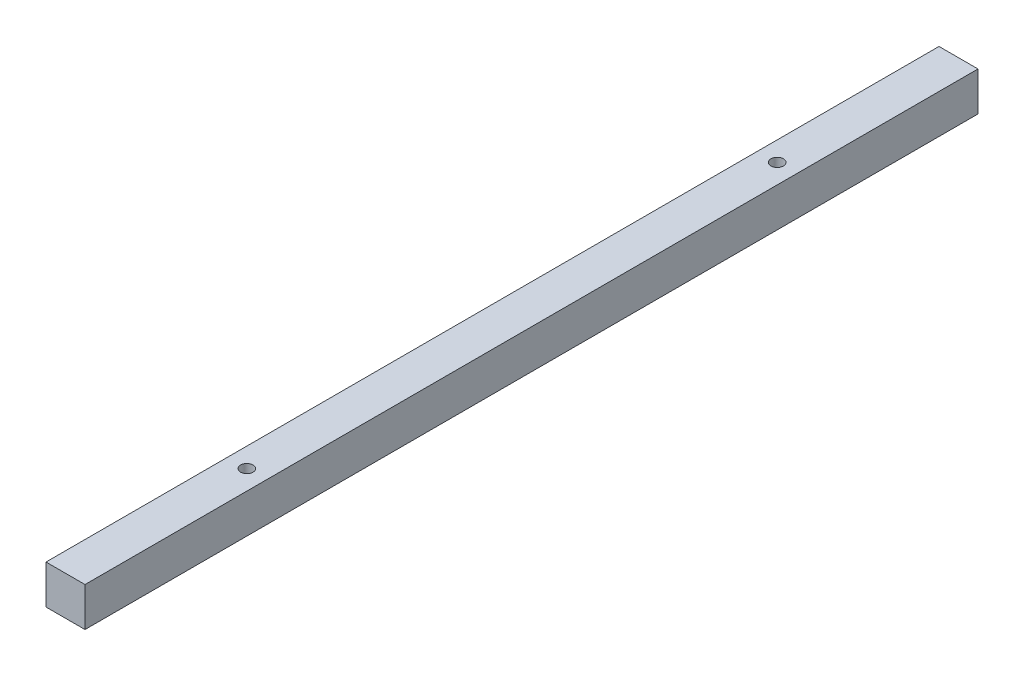
ISO-10303-21;
HEADER;
FILE_DESCRIPTION(('STEP AP214'),'2;1');
FILE_NAME('part.step','',(''),(''),'','','');
FILE_SCHEMA(('AUTOMOTIVE_DESIGN { 1 0 10303 214 1 1 1 1 }'));
ENDSEC;
DATA;
#1=APPLICATION_CONTEXT('core data for automotive mechanical design processes');
#2=APPLICATION_PROTOCOL_DEFINITION('international standard','automotive_design',2000,#1);
#3=PRODUCT_CONTEXT('',#1,'mechanical');
#4=PRODUCT('Part','Part','',(#3));
#5=PRODUCT_RELATED_PRODUCT_CATEGORY('part','',(#4));
#6=PRODUCT_DEFINITION_FORMATION('','',#4);
#7=PRODUCT_DEFINITION_CONTEXT('part definition',#1,'design');
#8=PRODUCT_DEFINITION('design','',#6,#7);
#9=PRODUCT_DEFINITION_SHAPE('','',#8);
#10=(LENGTH_UNIT() NAMED_UNIT(*) SI_UNIT(.MILLI.,.METRE.));
#11=(NAMED_UNIT(*) PLANE_ANGLE_UNIT() SI_UNIT($,.RADIAN.));
#12=(NAMED_UNIT(*) SI_UNIT($,.STERADIAN.) SOLID_ANGLE_UNIT());
#13=UNCERTAINTY_MEASURE_WITH_UNIT(LENGTH_MEASURE(1.E-05),#10,'distance_accuracy_value','');
#14=(GEOMETRIC_REPRESENTATION_CONTEXT(3) GLOBAL_UNCERTAINTY_ASSIGNED_CONTEXT((#13)) GLOBAL_UNIT_ASSIGNED_CONTEXT((#10,
#11,#12)) REPRESENTATION_CONTEXT('',''));
#15=CARTESIAN_POINT('',(0.,0.,0.));
#16=DIRECTION('',(0.,0.,1.));
#17=DIRECTION('',(1.,0.,0.));
#18=AXIS2_PLACEMENT_3D('',#15,#16,#17);
#19=CARTESIAN_POINT('',(-5.,5.,128.642135623731));
#20=DIRECTION('',(1.,0.,0.));
#21=DIRECTION('',(0.,1.,0.));
#22=AXIS2_PLACEMENT_3D('',#19,#20,#21);
#23=PLANE('',#22);
#24=DIRECTION('',(0.,-1.,0.));
#25=VECTOR('',#24,1.);
#26=CARTESIAN_POINT('',(-5.,5.,114.5));
#27=LINE('',#26,#25);
#28=CARTESIAN_POINT('',(-4.99999999999999,5.,114.5));
#29=VERTEX_POINT('',#28);
#30=CARTESIAN_POINT('',(-4.99999999999999,-5.,114.5));
#31=VERTEX_POINT('',#30);
#32=EDGE_CURVE('E36',#29,#31,#27,.T.);
#33=ORIENTED_EDGE('',*,*,#32,.F.);
#34=DIRECTION('',(0.,0.,-1.));
#35=VECTOR('',#34,1.);
#36=CARTESIAN_POINT('',(-5.,5.,128.642135623731));
#37=LINE('',#36,#35);
#38=CARTESIAN_POINT('',(-5.,5.,-114.5));
#39=VERTEX_POINT('',#38);
#40=EDGE_CURVE('E103',#29,#39,#37,.T.);
#41=ORIENTED_EDGE('',*,*,#40,.T.);
#42=DIRECTION('',(0.,-1.,0.));
#43=VECTOR('',#42,1.);
#44=CARTESIAN_POINT('',(-5.,5.,-114.5));
#45=LINE('',#44,#43);
#46=CARTESIAN_POINT('',(-5.00000000000001,-5.,-114.5));
#47=VERTEX_POINT('',#46);
#48=EDGE_CURVE('E101',#39,#47,#45,.T.);
#49=ORIENTED_EDGE('',*,*,#48,.T.);
#50=DIRECTION('',(0.,0.,-1.));
#51=VECTOR('',#50,1.);
#52=CARTESIAN_POINT('',(-5.,-5.,128.642135623731));
#53=LINE('',#52,#51);
#54=EDGE_CURVE('E78',#31,#47,#53,.T.);
#55=ORIENTED_EDGE('',*,*,#54,.F.);
#56=EDGE_LOOP('',(#33,#41,#49,#55));
#57=FACE_BOUND('',#56,.T.);
#58=ADVANCED_FACE('F33',(#57),#23,.F.);
#59=CARTESIAN_POINT('',(-5.,-5.,128.642135623731));
#60=DIRECTION('',(0.,1.,0.));
#61=DIRECTION('',(0.,0.,1.));
#62=AXIS2_PLACEMENT_3D('',#59,#60,#61);
#63=PLANE('',#62);
#64=CARTESIAN_POINT('',(0.,-5.,68.));
#65=DIRECTION('',(0.,1.,0.));
#66=DIRECTION('',(0.,0.,1.));
#67=AXIS2_PLACEMENT_3D('',#64,#65,#66);
#68=CIRCLE('',#67,1.6);
#69=CARTESIAN_POINT('',(0.,-5.,69.6));
#70=VERTEX_POINT('',#69);
#71=EDGE_CURVE('E143',#70,#70,#68,.T.);
#72=ORIENTED_EDGE('',*,*,#71,.T.);
#73=EDGE_LOOP('',(#72));
#74=FACE_BOUND('',#73,.T.);
#75=CARTESIAN_POINT('',(0.,-5.,-68.));
#76=DIRECTION('',(0.,1.,0.));
#77=DIRECTION('',(0.,0.,1.));
#78=AXIS2_PLACEMENT_3D('',#75,#76,#77);
#79=CIRCLE('',#78,1.6);
#80=CARTESIAN_POINT('',(0.,-5.,-66.4));
#81=VERTEX_POINT('',#80);
#82=EDGE_CURVE('E93',#81,#81,#79,.T.);
#83=ORIENTED_EDGE('',*,*,#82,.T.);
#84=EDGE_LOOP('',(#83));
#85=FACE_BOUND('',#84,.T.);
#86=DIRECTION('',(1.,0.,0.));
#87=VECTOR('',#86,1.);
#88=CARTESIAN_POINT('',(-5.,-5.,114.5));
#89=LINE('',#88,#87);
#90=CARTESIAN_POINT('',(5.00000000000001,-5.,114.5));
#91=VERTEX_POINT('',#90);
#92=EDGE_CURVE('E48',#31,#91,#89,.T.);
#93=ORIENTED_EDGE('',*,*,#92,.F.);
#94=ORIENTED_EDGE('',*,*,#54,.T.);
#95=DIRECTION('',(1.,0.,0.));
#96=VECTOR('',#95,1.);
#97=CARTESIAN_POINT('',(-5.,-5.,-114.5));
#98=LINE('',#97,#96);
#99=CARTESIAN_POINT('',(5.,-5.,-114.5));
#100=VERTEX_POINT('',#99);
#101=EDGE_CURVE('E86',#47,#100,#98,.T.);
#102=ORIENTED_EDGE('',*,*,#101,.T.);
#103=DIRECTION('',(0.,0.,-1.));
#104=VECTOR('',#103,1.);
#105=CARTESIAN_POINT('',(5.,-5.,128.642135623731));
#106=LINE('',#105,#104);
#107=EDGE_CURVE('E70',#91,#100,#106,.T.);
#108=ORIENTED_EDGE('',*,*,#107,.F.);
#109=EDGE_LOOP('',(#93,#94,#102,#108));
#110=FACE_BOUND('',#109,.T.);
#111=ADVANCED_FACE('F91',(#74,#85,#110),#63,.F.);
#112=CARTESIAN_POINT('',(5.,5.,128.642135623731));
#113=DIRECTION('',(-1.,0.,0.));
#114=DIRECTION('',(0.,-1.,0.));
#115=AXIS2_PLACEMENT_3D('',#112,#113,#114);
#116=PLANE('',#115);
#117=DIRECTION('',(0.,1.,0.));
#118=VECTOR('',#117,1.);
#119=CARTESIAN_POINT('',(5.,5.,114.5));
#120=LINE('',#119,#118);
#121=CARTESIAN_POINT('',(5.,5.,114.5));
#122=VERTEX_POINT('',#121);
#123=EDGE_CURVE('E75',#91,#122,#120,.T.);
#124=ORIENTED_EDGE('',*,*,#123,.F.);
#125=ORIENTED_EDGE('',*,*,#107,.T.);
#126=DIRECTION('',(0.,1.,0.));
#127=VECTOR('',#126,1.);
#128=CARTESIAN_POINT('',(5.,5.,-114.5));
#129=LINE('',#128,#127);
#130=CARTESIAN_POINT('',(4.99999999999999,5.,-114.5));
#131=VERTEX_POINT('',#130);
#132=EDGE_CURVE('E74',#100,#131,#129,.T.);
#133=ORIENTED_EDGE('',*,*,#132,.T.);
#134=DIRECTION('',(0.,0.,-1.));
#135=VECTOR('',#134,1.);
#136=CARTESIAN_POINT('',(5.,5.,128.642135623731));
#137=LINE('',#136,#135);
#138=EDGE_CURVE('E79',#122,#131,#137,.T.);
#139=ORIENTED_EDGE('',*,*,#138,.F.);
#140=EDGE_LOOP('',(#124,#125,#133,#139));
#141=FACE_BOUND('',#140,.T.);
#142=ADVANCED_FACE('F72',(#141),#116,.F.);
#143=CARTESIAN_POINT('',(-5.,5.,128.642135623731));
#144=DIRECTION('',(0.,-1.,0.));
#145=DIRECTION('',(0.,0.,-1.));
#146=AXIS2_PLACEMENT_3D('',#143,#144,#145);
#147=PLANE('',#146);
#148=CARTESIAN_POINT('',(0.,5.,68.));
#149=DIRECTION('',(0.,1.,0.));
#150=DIRECTION('',(0.,0.,1.));
#151=AXIS2_PLACEMENT_3D('',#148,#149,#150);
#152=CIRCLE('',#151,1.6);
#153=CARTESIAN_POINT('',(0.,5.,69.6));
#154=VERTEX_POINT('',#153);
#155=EDGE_CURVE('E146',#154,#154,#152,.T.);
#156=ORIENTED_EDGE('',*,*,#155,.F.);
#157=EDGE_LOOP('',(#156));
#158=FACE_BOUND('',#157,.T.);
#159=CARTESIAN_POINT('',(0.,5.,-68.));
#160=DIRECTION('',(0.,1.,0.));
#161=DIRECTION('',(0.,0.,1.));
#162=AXIS2_PLACEMENT_3D('',#159,#160,#161);
#163=CIRCLE('',#162,1.6);
#164=CARTESIAN_POINT('',(0.,5.,-66.4));
#165=VERTEX_POINT('',#164);
#166=EDGE_CURVE('E96',#165,#165,#163,.T.);
#167=ORIENTED_EDGE('',*,*,#166,.F.);
#168=EDGE_LOOP('',(#167));
#169=FACE_BOUND('',#168,.T.);
#170=DIRECTION('',(-1.,0.,0.));
#171=VECTOR('',#170,1.);
#172=CARTESIAN_POINT('',(-5.,5.,114.5));
#173=LINE('',#172,#171);
#174=EDGE_CURVE('E11',#122,#29,#173,.T.);
#175=ORIENTED_EDGE('',*,*,#174,.F.);
#176=ORIENTED_EDGE('',*,*,#138,.T.);
#177=DIRECTION('',(-1.,0.,0.));
#178=VECTOR('',#177,1.);
#179=CARTESIAN_POINT('',(-5.,5.,-114.5));
#180=LINE('',#179,#178);
#181=EDGE_CURVE('E89',#131,#39,#180,.T.);
#182=ORIENTED_EDGE('',*,*,#181,.T.);
#183=ORIENTED_EDGE('',*,*,#40,.F.);
#184=EDGE_LOOP('',(#175,#176,#182,#183));
#185=FACE_BOUND('',#184,.T.);
#186=ADVANCED_FACE('F111',(#158,#169,#185),#147,.F.);
#187=CARTESIAN_POINT('',(0.,-12.,114.5));
#188=DIRECTION('',(0.,0.,1.));
#189=DIRECTION('',(0.,-1.,0.));
#190=AXIS2_PLACEMENT_3D('',#187,#188,#189);
#191=PLANE('',#190);
#192=ORIENTED_EDGE('',*,*,#92,.T.);
#193=ORIENTED_EDGE('',*,*,#123,.T.);
#194=ORIENTED_EDGE('',*,*,#174,.T.);
#195=ORIENTED_EDGE('',*,*,#32,.T.);
#196=EDGE_LOOP('',(#192,#193,#194,#195));
#197=FACE_BOUND('',#196,.T.);
#198=ADVANCED_FACE('F107',(#197),#191,.T.);
#199=CARTESIAN_POINT('',(0.,-12.,-114.5));
#200=DIRECTION('',(0.,0.,-1.));
#201=DIRECTION('',(0.,-1.,0.));
#202=AXIS2_PLACEMENT_3D('',#199,#200,#201);
#203=PLANE('',#202);
#204=ORIENTED_EDGE('',*,*,#101,.F.);
#205=ORIENTED_EDGE('',*,*,#48,.F.);
#206=ORIENTED_EDGE('',*,*,#181,.F.);
#207=ORIENTED_EDGE('',*,*,#132,.F.);
#208=EDGE_LOOP('',(#204,#205,#206,#207));
#209=FACE_BOUND('',#208,.T.);
#210=ADVANCED_FACE('F84',(#209),#203,.T.);
#211=CARTESIAN_POINT('',(0.,-5.,-68.));
#212=DIRECTION('',(0.,1.,0.));
#213=DIRECTION('',(0.,0.,1.));
#214=AXIS2_PLACEMENT_3D('',#211,#212,#213);
#215=CYLINDRICAL_SURFACE('',#214,1.6);
#216=ORIENTED_EDGE('',*,*,#82,.F.);
#217=EDGE_LOOP('',(#216));
#218=FACE_BOUND('',#217,.T.);
#219=ORIENTED_EDGE('',*,*,#166,.T.);
#220=EDGE_LOOP('',(#219));
#221=FACE_BOUND('',#220,.T.);
#222=ADVANCED_FACE('F132',(#218,#221),#215,.F.);
#223=CARTESIAN_POINT('',(0.,-5.,68.));
#224=DIRECTION('',(0.,1.,0.));
#225=DIRECTION('',(0.,0.,1.));
#226=AXIS2_PLACEMENT_3D('',#223,#224,#225);
#227=CYLINDRICAL_SURFACE('',#226,1.6);
#228=ORIENTED_EDGE('',*,*,#71,.F.);
#229=EDGE_LOOP('',(#228));
#230=FACE_BOUND('',#229,.T.);
#231=ORIENTED_EDGE('',*,*,#155,.T.);
#232=EDGE_LOOP('',(#231));
#233=FACE_BOUND('',#232,.T.);
#234=ADVANCED_FACE('F135',(#230,#233),#227,.F.);
#235=CLOSED_SHELL('',(#58,#111,#142,#186,#198,#210,#222,#234));
#236=MANIFOLD_SOLID_BREP('B2',#235);
#237=ADVANCED_BREP_SHAPE_REPRESENTATION('',(#18,#236),#14);
#238=SHAPE_DEFINITION_REPRESENTATION(#9,#237);
ENDSEC;
END-ISO-10303-21;
